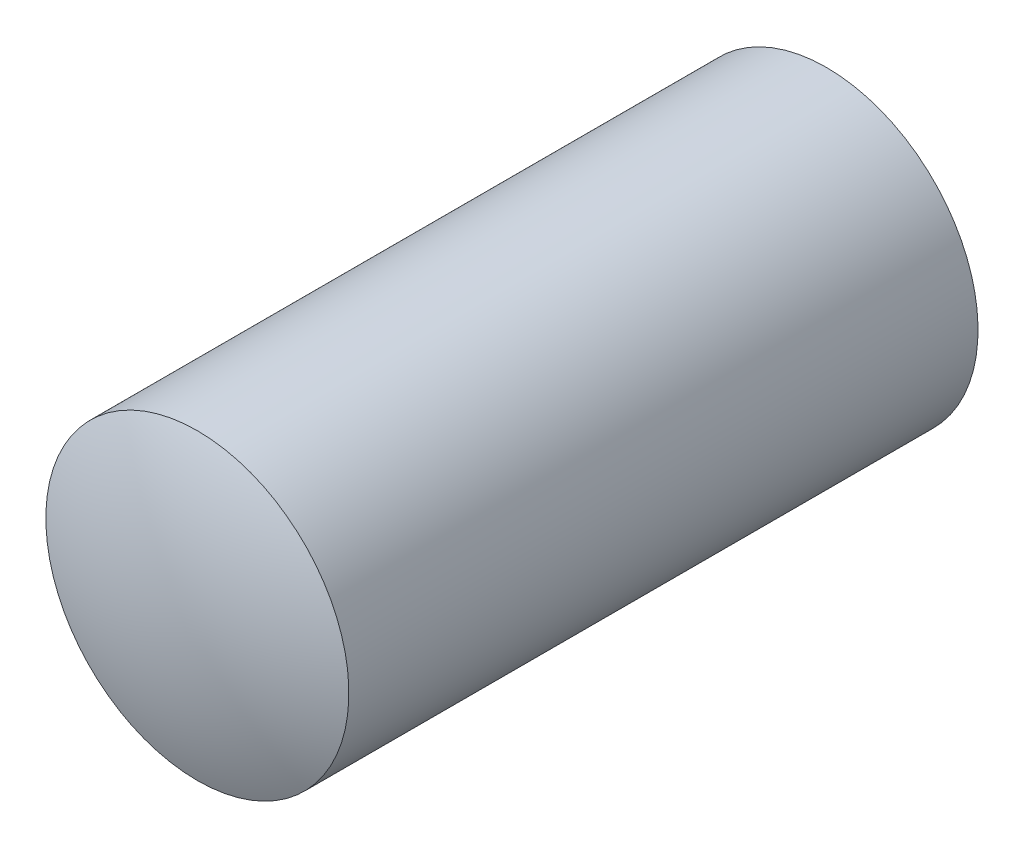
ISO-10303-21;
HEADER;
FILE_DESCRIPTION(('STEP AP214'),'2;1');
FILE_NAME('part.step','',(''),(''),'','','');
FILE_SCHEMA(('AUTOMOTIVE_DESIGN { 1 0 10303 214 1 1 1 1 }'));
ENDSEC;
DATA;
#1=APPLICATION_CONTEXT('core data for automotive mechanical design processes');
#2=APPLICATION_PROTOCOL_DEFINITION('international standard','automotive_design',2000,#1);
#3=PRODUCT_CONTEXT('',#1,'mechanical');
#4=PRODUCT('Part','Part','',(#3));
#5=PRODUCT_RELATED_PRODUCT_CATEGORY('part','',(#4));
#6=PRODUCT_DEFINITION_FORMATION('','',#4);
#7=PRODUCT_DEFINITION_CONTEXT('part definition',#1,'design');
#8=PRODUCT_DEFINITION('design','',#6,#7);
#9=PRODUCT_DEFINITION_SHAPE('','',#8);
#10=(LENGTH_UNIT() NAMED_UNIT(*) SI_UNIT(.MILLI.,.METRE.));
#11=(NAMED_UNIT(*) PLANE_ANGLE_UNIT() SI_UNIT($,.RADIAN.));
#12=(NAMED_UNIT(*) SI_UNIT($,.STERADIAN.) SOLID_ANGLE_UNIT());
#13=UNCERTAINTY_MEASURE_WITH_UNIT(LENGTH_MEASURE(1.E-05),#10,'distance_accuracy_value','');
#14=(GEOMETRIC_REPRESENTATION_CONTEXT(3) GLOBAL_UNCERTAINTY_ASSIGNED_CONTEXT((#13)) GLOBAL_UNIT_ASSIGNED_CONTEXT((#10,
#11,#12)) REPRESENTATION_CONTEXT('',''));
#15=CARTESIAN_POINT('',(0.,0.,0.));
#16=DIRECTION('',(0.,0.,1.));
#17=DIRECTION('',(1.,0.,0.));
#18=AXIS2_PLACEMENT_3D('',#15,#16,#17);
#19=CARTESIAN_POINT('',(0.,0.,1.87285223367698));
#20=DIRECTION('',(0.,0.,-1.));
#21=DIRECTION('',(0.,-1.,0.));
#22=AXIS2_PLACEMENT_3D('',#19,#20,#21);
#23=SPHERICAL_SURFACE('',#22,10.);
#24=CARTESIAN_POINT('',(0.,0.,11.0915492674231));
#25=DIRECTION('',(0.,0.,-1.));
#26=DIRECTION('',(0.,1.,0.));
#27=AXIS2_PLACEMENT_3D('',#24,#25,#26);
#28=CIRCLE('',#27,3.875);
#29=CARTESIAN_POINT('',(0.,3.875,11.0915492674231));
#30=VERTEX_POINT('',#29);
#31=EDGE_CURVE('E50',#30,#30,#28,.T.);
#32=ORIENTED_EDGE('',*,*,#31,.F.);
#33=EDGE_LOOP('',(#32));
#34=FACE_BOUND('',#33,.T.);
#35=ADVANCED_FACE('F43',(#34),#23,.T.);
#36=CARTESIAN_POINT('',(0.,0.,-5.));
#37=DIRECTION('',(0.,0.,-1.));
#38=DIRECTION('',(0.,1.,0.));
#39=AXIS2_PLACEMENT_3D('',#36,#37,#38);
#40=PLANE('',#39);
#41=CARTESIAN_POINT('',(0.,0.,-5.));
#42=DIRECTION('',(0.,0.,-1.));
#43=DIRECTION('',(0.,1.,0.));
#44=AXIS2_PLACEMENT_3D('',#41,#42,#43);
#45=CIRCLE('',#44,3.875);
#46=CARTESIAN_POINT('',(0.,3.875,-5.));
#47=VERTEX_POINT('',#46);
#48=EDGE_CURVE('E10',#47,#47,#45,.T.);
#49=ORIENTED_EDGE('',*,*,#48,.T.);
#50=EDGE_LOOP('',(#49));
#51=FACE_BOUND('',#50,.T.);
#52=ADVANCED_FACE('F61',(#51),#40,.T.);
#53=CARTESIAN_POINT('',(0.,0.,0.));
#54=DIRECTION('',(0.,0.,-1.));
#55=DIRECTION('',(0.,1.,0.));
#56=AXIS2_PLACEMENT_3D('',#53,#54,#55);
#57=CYLINDRICAL_SURFACE('',#56,3.875);
#58=ORIENTED_EDGE('',*,*,#31,.T.);
#59=EDGE_LOOP('',(#58));
#60=FACE_BOUND('',#59,.T.);
#61=ORIENTED_EDGE('',*,*,#48,.F.);
#62=EDGE_LOOP('',(#61));
#63=FACE_BOUND('',#62,.T.);
#64=ADVANCED_FACE('F57',(#60,#63),#57,.T.);
#65=CLOSED_SHELL('',(#35,#52,#64));
#66=MANIFOLD_SOLID_BREP('B2',#65);
#67=ADVANCED_BREP_SHAPE_REPRESENTATION('',(#18,#66),#14);
#68=SHAPE_DEFINITION_REPRESENTATION(#9,#67);
ENDSEC;
END-ISO-10303-21;
